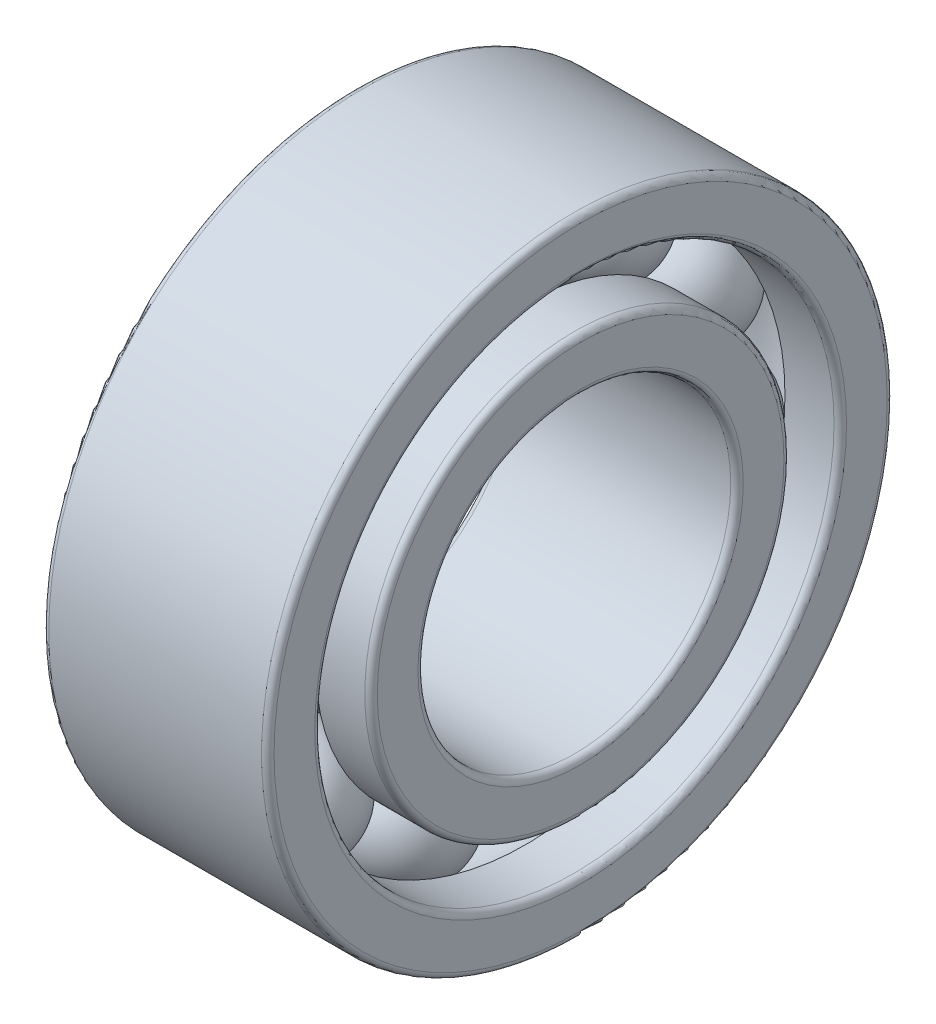
ISO-10303-21;
HEADER;
FILE_DESCRIPTION(('STEP AP214'),'2;1');
FILE_NAME('part.step','',(''),(''),'','','');
FILE_SCHEMA(('AUTOMOTIVE_DESIGN { 1 0 10303 214 1 1 1 1 }'));
ENDSEC;
DATA;
#1=APPLICATION_CONTEXT('core data for automotive mechanical design processes');
#2=APPLICATION_PROTOCOL_DEFINITION('international standard','automotive_design',2000,#1);
#3=PRODUCT_CONTEXT('',#1,'mechanical');
#4=PRODUCT('Part','Part','',(#3));
#5=PRODUCT_RELATED_PRODUCT_CATEGORY('part','',(#4));
#6=PRODUCT_DEFINITION_FORMATION('','',#4);
#7=PRODUCT_DEFINITION_CONTEXT('part definition',#1,'design');
#8=PRODUCT_DEFINITION('design','',#6,#7);
#9=PRODUCT_DEFINITION_SHAPE('','',#8);
#10=(LENGTH_UNIT() NAMED_UNIT(*) SI_UNIT(.MILLI.,.METRE.));
#11=(NAMED_UNIT(*) PLANE_ANGLE_UNIT() SI_UNIT($,.RADIAN.));
#12=(NAMED_UNIT(*) SI_UNIT($,.STERADIAN.) SOLID_ANGLE_UNIT());
#13=UNCERTAINTY_MEASURE_WITH_UNIT(LENGTH_MEASURE(1.E-05),#10,'distance_accuracy_value','');
#14=(GEOMETRIC_REPRESENTATION_CONTEXT(3) GLOBAL_UNCERTAINTY_ASSIGNED_CONTEXT((#13)) GLOBAL_UNIT_ASSIGNED_CONTEXT((#10,
#11,#12)) REPRESENTATION_CONTEXT('',''));
#15=CARTESIAN_POINT('',(0.,0.,0.));
#16=DIRECTION('',(0.,0.,1.));
#17=DIRECTION('',(1.,0.,0.));
#18=AXIS2_PLACEMENT_3D('',#15,#16,#17);
#19=CARTESIAN_POINT('',(-9.,15.7735037405848,-10.1370153272922));
#20=DIRECTION('',(-1.,0.,0.));
#21=DIRECTION('',(0.,0.841253532831188,-0.540640817455586));
#22=AXIS2_PLACEMENT_3D('',#19,#20,#21);
#23=SPHERICAL_SURFACE('',#22,4.75);
#24=CARTESIAN_POINT('',(-13.75,15.7735037405848,-10.1370153272922));
#25=VERTEX_POINT('',#24);
#26=VERTEX_LOOP('',#25);
#27=FACE_BOUND('',#26,.T.);
#28=ADVANCED_FACE('F38',(#27),#23,.T.);
#29=CLOSED_SHELL('',(#28));
#30=MANIFOLD_SOLID_BREP('B2',#29);
#31=CARTESIAN_POINT('',(-9.,7.78903149378557,-17.0555999128971));
#32=DIRECTION('',(-1.,0.,0.));
#33=DIRECTION('',(0.,0.415415013001897,-0.909631995354513));
#34=AXIS2_PLACEMENT_3D('',#31,#32,#33);
#35=SPHERICAL_SURFACE('',#34,4.75);
#36=CARTESIAN_POINT('',(-13.75,7.78903149378557,-17.0555999128971));
#37=VERTEX_POINT('',#36);
#38=VERTEX_LOOP('',#37);
#39=FACE_BOUND('',#38,.T.);
#40=ADVANCED_FACE('F57',(#39),#35,.T.);
#41=CLOSED_SHELL('',(#40));
#42=MANIFOLD_SOLID_BREP('B6',#41);
#43=CARTESIAN_POINT('',(-9.,-2.6684032176239,-18.5591520352675));
#44=DIRECTION('',(-1.,0.,0.));
#45=DIRECTION('',(0.,-0.142314838273275,-0.989821441880934));
#46=AXIS2_PLACEMENT_3D('',#43,#44,#45);
#47=SPHERICAL_SURFACE('',#46,4.75);
#48=CARTESIAN_POINT('',(-13.75,-2.6684032176239,-18.5591520352675));
#49=VERTEX_POINT('',#48);
#50=VERTEX_LOOP('',#49);
#51=FACE_BOUND('',#50,.T.);
#52=ADVANCED_FACE('F76',(#51),#47,.T.);
#53=CLOSED_SHELL('',(#52));
#54=MANIFOLD_SOLID_BREP('B34',#53);
#55=CARTESIAN_POINT('',(-9.,-12.278638761474,-14.1703045191425));
#56=DIRECTION('',(-1.,0.,0.));
#57=DIRECTION('',(0.,-0.654860733945278,-0.755749574354264));
#58=AXIS2_PLACEMENT_3D('',#55,#56,#57);
#59=SPHERICAL_SURFACE('',#58,4.75);
#60=CARTESIAN_POINT('',(-13.75,-12.278638761474,-14.1703045191425));
#61=VERTEX_POINT('',#60);
#62=VERTEX_LOOP('',#61);
#63=FACE_BOUND('',#62,.T.);
#64=ADVANCED_FACE('F95',(#63),#59,.T.);
#65=CLOSED_SHELL('',(#64));
#66=MANIFOLD_SOLID_BREP('B53',#65);
#67=CARTESIAN_POINT('',(-9.,-17.9904932552718,-5.28248544077695));
#68=DIRECTION('',(-1.,0.,0.));
#69=DIRECTION('',(0.,-0.959492973614495,-0.281732556841437));
#70=AXIS2_PLACEMENT_3D('',#67,#68,#69);
#71=SPHERICAL_SURFACE('',#70,4.75);
#72=CARTESIAN_POINT('',(-13.75,-17.9904932552718,-5.28248544077695));
#73=VERTEX_POINT('',#72);
#74=VERTEX_LOOP('',#73);
#75=FACE_BOUND('',#74,.T.);
#76=ADVANCED_FACE('F114',(#75),#71,.T.);
#77=CLOSED_SHELL('',(#76));
#78=MANIFOLD_SOLID_BREP('B72',#77);
#79=CARTESIAN_POINT('',(-9.,-17.9904932552719,5.28248544077669));
#80=DIRECTION('',(-1.,0.,0.));
#81=DIRECTION('',(0.,-0.959492973614499,0.281732556841423));
#82=AXIS2_PLACEMENT_3D('',#79,#80,#81);
#83=SPHERICAL_SURFACE('',#82,4.75);
#84=CARTESIAN_POINT('',(-13.75,-17.9904932552719,5.28248544077669));
#85=VERTEX_POINT('',#84);
#86=VERTEX_LOOP('',#85);
#87=FACE_BOUND('',#86,.T.);
#88=ADVANCED_FACE('F133',(#87),#83,.T.);
#89=CLOSED_SHELL('',(#88));
#90=MANIFOLD_SOLID_BREP('B91',#89);
#91=CARTESIAN_POINT('',(-9.,-12.2786387614742,14.1703045191423));
#92=DIRECTION('',(-1.,0.,0.));
#93=DIRECTION('',(0.,-0.654860733945289,0.755749574354255));
#94=AXIS2_PLACEMENT_3D('',#91,#92,#93);
#95=SPHERICAL_SURFACE('',#94,4.75);
#96=CARTESIAN_POINT('',(-13.75,-12.2786387614742,14.1703045191423));
#97=VERTEX_POINT('',#96);
#98=VERTEX_LOOP('',#97);
#99=FACE_BOUND('',#98,.T.);
#100=ADVANCED_FACE('F152',(#99),#95,.T.);
#101=CLOSED_SHELL('',(#100));
#102=MANIFOLD_SOLID_BREP('B110',#101);
#103=CARTESIAN_POINT('',(-9.,-2.66840321762417,18.5591520352675));
#104=DIRECTION('',(-1.,0.,0.));
#105=DIRECTION('',(0.,-0.142314838273289,0.989821441880932));
#106=AXIS2_PLACEMENT_3D('',#103,#104,#105);
#107=SPHERICAL_SURFACE('',#106,4.75);
#108=CARTESIAN_POINT('',(-13.75,-2.66840321762417,18.5591520352675));
#109=VERTEX_POINT('',#108);
#110=VERTEX_LOOP('',#109);
#111=FACE_BOUND('',#110,.T.);
#112=ADVANCED_FACE('F171',(#111),#107,.T.);
#113=CLOSED_SHELL('',(#112));
#114=MANIFOLD_SOLID_BREP('B129',#113);
#115=CARTESIAN_POINT('',(-9.,7.78903149378533,17.0555999128972));
#116=DIRECTION('',(-1.,0.,0.));
#117=DIRECTION('',(0.,0.415415013001884,0.909631995354519));
#118=AXIS2_PLACEMENT_3D('',#115,#116,#117);
#119=SPHERICAL_SURFACE('',#118,4.75);
#120=CARTESIAN_POINT('',(-13.75,7.78903149378533,17.0555999128972));
#121=VERTEX_POINT('',#120);
#122=VERTEX_LOOP('',#121);
#123=FACE_BOUND('',#122,.T.);
#124=ADVANCED_FACE('F190',(#123),#119,.T.);
#125=CLOSED_SHELL('',(#124));
#126=MANIFOLD_SOLID_BREP('B148',#125);
#127=CARTESIAN_POINT('',(-9.,15.7735037405846,10.1370153272925));
#128=DIRECTION('',(-1.,0.,0.));
#129=DIRECTION('',(0.,0.841253532831181,0.540640817455599));
#130=AXIS2_PLACEMENT_3D('',#127,#128,#129);
#131=SPHERICAL_SURFACE('',#130,4.75);
#132=CARTESIAN_POINT('',(-13.75,15.7735037405846,10.1370153272925));
#133=VERTEX_POINT('',#132);
#134=VERTEX_LOOP('',#133);
#135=FACE_BOUND('',#134,.T.);
#136=ADVANCED_FACE('F209',(#135),#131,.T.);
#137=CLOSED_SHELL('',(#136));
#138=MANIFOLD_SOLID_BREP('B167',#137);
#139=CARTESIAN_POINT('',(-9.,18.75,0.));
#140=DIRECTION('',(-1.,0.,0.));
#141=DIRECTION('',(0.,1.,0.));
#142=AXIS2_PLACEMENT_3D('',#139,#140,#141);
#143=SPHERICAL_SURFACE('',#142,4.75);
#144=CARTESIAN_POINT('',(-13.75,18.75,0.));
#145=VERTEX_POINT('',#144);
#146=VERTEX_LOOP('',#145);
#147=FACE_BOUND('',#146,.T.);
#148=ADVANCED_FACE('F230',(#147),#143,.T.);
#149=CLOSED_SHELL('',(#148));
#150=MANIFOLD_SOLID_BREP('B186',#149);
#151=CARTESIAN_POINT('',(0.,12.5,0.));
#152=DIRECTION('',(1.,0.,0.));
#153=DIRECTION('',(0.,0.,-1.));
#154=AXIS2_PLACEMENT_3D('',#151,#152,#153);
#155=PLANE('',#154);
#156=CARTESIAN_POINT('',(0.,0.,0.));
#157=DIRECTION('',(1.,0.,0.));
#158=DIRECTION('',(0.,0.,-1.));
#159=AXIS2_PLACEMENT_3D('',#156,#157,#158);
#160=CIRCLE('',#159,13.);
#161=CARTESIAN_POINT('',(0.,0.,-13.));
#162=VERTEX_POINT('',#161);
#163=EDGE_CURVE('E261',#162,#162,#160,.F.);
#164=ORIENTED_EDGE('',*,*,#163,.T.);
#165=EDGE_LOOP('',(#164));
#166=FACE_BOUND('',#165,.T.);
#167=CARTESIAN_POINT('',(0.,0.,0.));
#168=DIRECTION('',(1.,0.,0.));
#169=DIRECTION('',(0.,0.,-1.));
#170=AXIS2_PLACEMENT_3D('',#167,#168,#169);
#171=CIRCLE('',#170,16.25);
#172=CARTESIAN_POINT('',(0.,0.,-16.25));
#173=VERTEX_POINT('',#172);
#174=EDGE_CURVE('E265',#173,#173,#171,.T.);
#175=ORIENTED_EDGE('',*,*,#174,.T.);
#176=EDGE_LOOP('',(#175));
#177=FACE_BOUND('',#176,.T.);
#178=ADVANCED_FACE('F250',(#166,#177),#155,.T.);
#179=CARTESIAN_POINT('',(0.,0.,0.));
#180=DIRECTION('',(1.,0.,0.));
#181=DIRECTION('',(0.,0.,-1.));
#182=AXIS2_PLACEMENT_3D('',#179,#180,#181);
#183=CYLINDRICAL_SURFACE('',#182,16.75);
#184=CARTESIAN_POINT('',(-0.5,0.,0.));
#185=DIRECTION('',(1.,0.,0.));
#186=DIRECTION('',(0.,0.,-1.));
#187=AXIS2_PLACEMENT_3D('',#184,#185,#186);
#188=CIRCLE('',#187,16.75);
#189=CARTESIAN_POINT('',(-0.5,0.,-16.75));
#190=VERTEX_POINT('',#189);
#191=EDGE_CURVE('E257',#190,#190,#188,.F.);
#192=ORIENTED_EDGE('',*,*,#191,.T.);
#193=EDGE_LOOP('',(#192));
#194=FACE_BOUND('',#193,.T.);
#195=CARTESIAN_POINT('',(-4.41742430504416,0.,0.));
#196=DIRECTION('',(1.,0.,0.));
#197=DIRECTION('',(0.,0.,-1.));
#198=AXIS2_PLACEMENT_3D('',#195,#196,#197);
#199=CIRCLE('',#198,16.75);
#200=CARTESIAN_POINT('',(-4.41742430504416,0.,-16.75));
#201=VERTEX_POINT('',#200);
#202=EDGE_CURVE('E282',#201,#201,#199,.T.);
#203=ORIENTED_EDGE('',*,*,#202,.T.);
#204=EDGE_LOOP('',(#203));
#205=FACE_BOUND('',#204,.T.);
#206=ADVANCED_FACE('F303',(#194,#205),#183,.T.);
#207=CARTESIAN_POINT('',(-9.,0.,0.));
#208=DIRECTION('',(1.,0.,0.));
#209=DIRECTION('',(0.,0.,-1.));
#210=AXIS2_PLACEMENT_3D('',#207,#208,#209);
#211=TOROIDAL_SURFACE('',#210,18.75,5.);
#212=CARTESIAN_POINT('',(-13.5825756949558,0.,0.));
#213=DIRECTION('',(1.,0.,0.));
#214=DIRECTION('',(0.,0.,-1.));
#215=AXIS2_PLACEMENT_3D('',#212,#213,#214);
#216=CIRCLE('',#215,16.75);
#217=CARTESIAN_POINT('',(-13.5825756949558,0.,-16.75));
#218=VERTEX_POINT('',#217);
#219=EDGE_CURVE('E285',#218,#218,#216,.T.);
#220=ORIENTED_EDGE('',*,*,#219,.T.);
#221=EDGE_LOOP('',(#220));
#222=FACE_BOUND('',#221,.T.);
#223=ORIENTED_EDGE('',*,*,#202,.F.);
#224=EDGE_LOOP('',(#223));
#225=FACE_BOUND('',#224,.T.);
#226=ADVANCED_FACE('F289',(#222,#225),#211,.F.);
#227=CARTESIAN_POINT('',(0.,0.,0.));
#228=DIRECTION('',(1.,0.,0.));
#229=DIRECTION('',(0.,0.,-1.));
#230=AXIS2_PLACEMENT_3D('',#227,#228,#229);
#231=CYLINDRICAL_SURFACE('',#230,16.75);
#232=CARTESIAN_POINT('',(-17.5,0.,0.));
#233=DIRECTION('',(-1.,0.,0.));
#234=DIRECTION('',(0.,0.,1.));
#235=AXIS2_PLACEMENT_3D('',#232,#233,#234);
#236=CIRCLE('',#235,16.75);
#237=CARTESIAN_POINT('',(-17.5,0.,16.75));
#238=VERTEX_POINT('',#237);
#239=EDGE_CURVE('E229',#238,#238,#236,.F.);
#240=ORIENTED_EDGE('',*,*,#239,.T.);
#241=EDGE_LOOP('',(#240));
#242=FACE_BOUND('',#241,.T.);
#243=ORIENTED_EDGE('',*,*,#219,.F.);
#244=EDGE_LOOP('',(#243));
#245=FACE_BOUND('',#244,.T.);
#246=ADVANCED_FACE('F292',(#242,#245),#231,.T.);
#247=CARTESIAN_POINT('',(-18.,16.75,0.));
#248=DIRECTION('',(-1.,0.,0.));
#249=DIRECTION('',(0.,0.,1.));
#250=AXIS2_PLACEMENT_3D('',#247,#248,#249);
#251=PLANE('',#250);
#252=CARTESIAN_POINT('',(-18.,0.,0.));
#253=DIRECTION('',(-1.,0.,0.));
#254=DIRECTION('',(0.,0.,1.));
#255=AXIS2_PLACEMENT_3D('',#252,#253,#254);
#256=CIRCLE('',#255,13.);
#257=CARTESIAN_POINT('',(-18.,0.,13.));
#258=VERTEX_POINT('',#257);
#259=EDGE_CURVE('E276',#258,#258,#256,.F.);
#260=ORIENTED_EDGE('',*,*,#259,.T.);
#261=EDGE_LOOP('',(#260));
#262=FACE_BOUND('',#261,.T.);
#263=CARTESIAN_POINT('',(-18.,0.,0.));
#264=DIRECTION('',(-1.,0.,0.));
#265=DIRECTION('',(0.,0.,1.));
#266=AXIS2_PLACEMENT_3D('',#263,#264,#265);
#267=CIRCLE('',#266,16.25);
#268=CARTESIAN_POINT('',(-18.,0.,16.25));
#269=VERTEX_POINT('',#268);
#270=EDGE_CURVE('E279',#269,#269,#267,.T.);
#271=ORIENTED_EDGE('',*,*,#270,.T.);
#272=EDGE_LOOP('',(#271));
#273=FACE_BOUND('',#272,.T.);
#274=ADVANCED_FACE('F294',(#262,#273),#251,.T.);
#275=CARTESIAN_POINT('',(0.,0.,0.));
#276=DIRECTION('',(1.,0.,0.));
#277=DIRECTION('',(0.,0.,-1.));
#278=AXIS2_PLACEMENT_3D('',#275,#276,#277);
#279=CYLINDRICAL_SURFACE('',#278,12.5);
#280=CARTESIAN_POINT('',(-17.5,0.,0.));
#281=DIRECTION('',(-1.,0.,0.));
#282=DIRECTION('',(0.,0.,1.));
#283=AXIS2_PLACEMENT_3D('',#280,#281,#282);
#284=CIRCLE('',#283,12.5);
#285=CARTESIAN_POINT('',(-17.5,0.,12.5));
#286=VERTEX_POINT('',#285);
#287=EDGE_CURVE('E270',#286,#286,#284,.T.);
#288=ORIENTED_EDGE('',*,*,#287,.T.);
#289=EDGE_LOOP('',(#288));
#290=FACE_BOUND('',#289,.T.);
#291=CARTESIAN_POINT('',(-0.5,0.,0.));
#292=DIRECTION('',(1.,0.,0.));
#293=DIRECTION('',(0.,0.,-1.));
#294=AXIS2_PLACEMENT_3D('',#291,#292,#293);
#295=CIRCLE('',#294,12.5);
#296=CARTESIAN_POINT('',(-0.5,0.,-12.5));
#297=VERTEX_POINT('',#296);
#298=EDGE_CURVE('E273',#297,#297,#295,.T.);
#299=ORIENTED_EDGE('',*,*,#298,.T.);
#300=EDGE_LOOP('',(#299));
#301=FACE_BOUND('',#300,.T.);
#302=ADVANCED_FACE('F300',(#290,#301),#279,.F.);
#303=CARTESIAN_POINT('',(-17.5,0.,0.));
#304=DIRECTION('',(-1.,0.,0.));
#305=DIRECTION('',(0.,0.,1.));
#306=AXIS2_PLACEMENT_3D('',#303,#304,#305);
#307=TOROIDAL_SURFACE('',#306,13.,0.5);
#308=ORIENTED_EDGE('',*,*,#287,.F.);
#309=EDGE_LOOP('',(#308));
#310=FACE_BOUND('',#309,.T.);
#311=ORIENTED_EDGE('',*,*,#259,.F.);
#312=EDGE_LOOP('',(#311));
#313=FACE_BOUND('',#312,.T.);
#314=ADVANCED_FACE('F314',(#310,#313),#307,.T.);
#315=CARTESIAN_POINT('',(-0.5,0.,0.));
#316=DIRECTION('',(1.,0.,0.));
#317=DIRECTION('',(0.,0.,-1.));
#318=AXIS2_PLACEMENT_3D('',#315,#316,#317);
#319=TOROIDAL_SURFACE('',#318,13.,0.5);
#320=ORIENTED_EDGE('',*,*,#163,.F.);
#321=EDGE_LOOP('',(#320));
#322=FACE_BOUND('',#321,.T.);
#323=ORIENTED_EDGE('',*,*,#298,.F.);
#324=EDGE_LOOP('',(#323));
#325=FACE_BOUND('',#324,.T.);
#326=ADVANCED_FACE('F317',(#322,#325),#319,.T.);
#327=CARTESIAN_POINT('',(-0.5,0.,0.));
#328=DIRECTION('',(1.,0.,0.));
#329=DIRECTION('',(0.,0.,-1.));
#330=AXIS2_PLACEMENT_3D('',#327,#328,#329);
#331=TOROIDAL_SURFACE('',#330,16.25,0.5);
#332=ORIENTED_EDGE('',*,*,#191,.F.);
#333=EDGE_LOOP('',(#332));
#334=FACE_BOUND('',#333,.T.);
#335=ORIENTED_EDGE('',*,*,#174,.F.);
#336=EDGE_LOOP('',(#335));
#337=FACE_BOUND('',#336,.T.);
#338=ADVANCED_FACE('F320',(#334,#337),#331,.T.);
#339=CARTESIAN_POINT('',(-17.5,0.,0.));
#340=DIRECTION('',(-1.,0.,0.));
#341=DIRECTION('',(0.,0.,1.));
#342=AXIS2_PLACEMENT_3D('',#339,#340,#341);
#343=TOROIDAL_SURFACE('',#342,16.25,0.5);
#344=ORIENTED_EDGE('',*,*,#270,.F.);
#345=EDGE_LOOP('',(#344));
#346=FACE_BOUND('',#345,.T.);
#347=ORIENTED_EDGE('',*,*,#239,.F.);
#348=EDGE_LOOP('',(#347));
#349=FACE_BOUND('',#348,.T.);
#350=ADVANCED_FACE('F252',(#346,#349),#343,.T.);
#351=CLOSED_SHELL('',(#178,#206,#226,#246,#274,#302,#314,#326,#338,#350));
#352=MANIFOLD_SOLID_BREP('B205',#351);
#353=CARTESIAN_POINT('',(0.,20.75,0.));
#354=DIRECTION('',(1.,0.,0.));
#355=DIRECTION('',(0.,0.,-1.));
#356=AXIS2_PLACEMENT_3D('',#353,#354,#355);
#357=PLANE('',#356);
#358=CARTESIAN_POINT('',(0.,0.,0.));
#359=DIRECTION('',(1.,0.,0.));
#360=DIRECTION('',(0.,0.,-1.));
#361=AXIS2_PLACEMENT_3D('',#358,#359,#360);
#362=CIRCLE('',#361,21.25);
#363=CARTESIAN_POINT('',(0.,0.,-21.25));
#364=VERTEX_POINT('',#363);
#365=EDGE_CURVE('E413',#364,#364,#362,.F.);
#366=ORIENTED_EDGE('',*,*,#365,.T.);
#367=EDGE_LOOP('',(#366));
#368=FACE_BOUND('',#367,.T.);
#369=CARTESIAN_POINT('',(0.,0.,0.));
#370=DIRECTION('',(1.,0.,0.));
#371=DIRECTION('',(0.,0.,-1.));
#372=AXIS2_PLACEMENT_3D('',#369,#370,#371);
#373=CIRCLE('',#372,24.5);
#374=CARTESIAN_POINT('',(0.,0.,-24.5));
#375=VERTEX_POINT('',#374);
#376=EDGE_CURVE('E417',#375,#375,#373,.T.);
#377=ORIENTED_EDGE('',*,*,#376,.T.);
#378=EDGE_LOOP('',(#377));
#379=FACE_BOUND('',#378,.T.);
#380=ADVANCED_FACE('F402',(#368,#379),#357,.T.);
#381=CARTESIAN_POINT('',(0.,0.,0.));
#382=DIRECTION('',(1.,0.,0.));
#383=DIRECTION('',(0.,0.,-1.));
#384=AXIS2_PLACEMENT_3D('',#381,#382,#383);
#385=CYLINDRICAL_SURFACE('',#384,25.);
#386=CARTESIAN_POINT('',(-0.5,0.,0.));
#387=DIRECTION('',(1.,0.,0.));
#388=DIRECTION('',(0.,0.,-1.));
#389=AXIS2_PLACEMENT_3D('',#386,#387,#388);
#390=CIRCLE('',#389,25.);
#391=CARTESIAN_POINT('',(-0.5,0.,-25.));
#392=VERTEX_POINT('',#391);
#393=EDGE_CURVE('E249',#392,#392,#390,.F.);
#394=ORIENTED_EDGE('',*,*,#393,.T.);
#395=EDGE_LOOP('',(#394));
#396=FACE_BOUND('',#395,.T.);
#397=CARTESIAN_POINT('',(-17.5,0.,0.));
#398=DIRECTION('',(-1.,0.,0.));
#399=DIRECTION('',(0.,0.,1.));
#400=AXIS2_PLACEMENT_3D('',#397,#398,#399);
#401=CIRCLE('',#400,25.);
#402=CARTESIAN_POINT('',(-17.5,0.,25.));
#403=VERTEX_POINT('',#402);
#404=EDGE_CURVE('E409',#403,#403,#401,.F.);
#405=ORIENTED_EDGE('',*,*,#404,.T.);
#406=EDGE_LOOP('',(#405));
#407=FACE_BOUND('',#406,.T.);
#408=ADVANCED_FACE('F459',(#396,#407),#385,.T.);
#409=CARTESIAN_POINT('',(-18.,25.,0.));
#410=DIRECTION('',(-1.,0.,0.));
#411=DIRECTION('',(0.,0.,1.));
#412=AXIS2_PLACEMENT_3D('',#409,#410,#411);
#413=PLANE('',#412);
#414=CARTESIAN_POINT('',(-18.,0.,0.));
#415=DIRECTION('',(-1.,0.,0.));
#416=DIRECTION('',(0.,0.,1.));
#417=AXIS2_PLACEMENT_3D('',#414,#415,#416);
#418=CIRCLE('',#417,21.25);
#419=CARTESIAN_POINT('',(-18.,0.,21.25));
#420=VERTEX_POINT('',#419);
#421=EDGE_CURVE('E428',#420,#420,#418,.F.);
#422=ORIENTED_EDGE('',*,*,#421,.T.);
#423=EDGE_LOOP('',(#422));
#424=FACE_BOUND('',#423,.T.);
#425=CARTESIAN_POINT('',(-18.,0.,0.));
#426=DIRECTION('',(-1.,0.,0.));
#427=DIRECTION('',(0.,0.,1.));
#428=AXIS2_PLACEMENT_3D('',#425,#426,#427);
#429=CIRCLE('',#428,24.5);
#430=CARTESIAN_POINT('',(-18.,0.,24.5));
#431=VERTEX_POINT('',#430);
#432=EDGE_CURVE('E431',#431,#431,#429,.T.);
#433=ORIENTED_EDGE('',*,*,#432,.T.);
#434=EDGE_LOOP('',(#433));
#435=FACE_BOUND('',#434,.T.);
#436=ADVANCED_FACE('F465',(#424,#435),#413,.T.);
#437=CARTESIAN_POINT('',(0.,0.,0.));
#438=DIRECTION('',(1.,0.,0.));
#439=DIRECTION('',(0.,0.,-1.));
#440=AXIS2_PLACEMENT_3D('',#437,#438,#439);
#441=CYLINDRICAL_SURFACE('',#440,20.75);
#442=CARTESIAN_POINT('',(-17.5,0.,0.));
#443=DIRECTION('',(-1.,0.,0.));
#444=DIRECTION('',(0.,0.,1.));
#445=AXIS2_PLACEMENT_3D('',#442,#443,#444);
#446=CIRCLE('',#445,20.75);
#447=CARTESIAN_POINT('',(-17.5,0.,20.75));
#448=VERTEX_POINT('',#447);
#449=EDGE_CURVE('E425',#448,#448,#446,.T.);
#450=ORIENTED_EDGE('',*,*,#449,.T.);
#451=EDGE_LOOP('',(#450));
#452=FACE_BOUND('',#451,.T.);
#453=CARTESIAN_POINT('',(-13.5825756949558,0.,0.));
#454=DIRECTION('',(1.,0.,0.));
#455=DIRECTION('',(0.,0.,-1.));
#456=AXIS2_PLACEMENT_3D('',#453,#454,#455);
#457=CIRCLE('',#456,20.75);
#458=CARTESIAN_POINT('',(-13.5825756949558,0.,-20.75));
#459=VERTEX_POINT('',#458);
#460=EDGE_CURVE('E434',#459,#459,#457,.T.);
#461=ORIENTED_EDGE('',*,*,#460,.T.);
#462=EDGE_LOOP('',(#461));
#463=FACE_BOUND('',#462,.T.);
#464=ADVANCED_FACE('F456',(#452,#463),#441,.F.);
#465=CARTESIAN_POINT('',(-9.,0.,0.));
#466=DIRECTION('',(1.,0.,0.));
#467=DIRECTION('',(0.,0.,-1.));
#468=AXIS2_PLACEMENT_3D('',#465,#466,#467);
#469=TOROIDAL_SURFACE('',#468,18.75,5.);
#470=CARTESIAN_POINT('',(-4.41742430504416,0.,0.));
#471=DIRECTION('',(1.,0.,0.));
#472=DIRECTION('',(0.,0.,-1.));
#473=AXIS2_PLACEMENT_3D('',#470,#471,#472);
#474=CIRCLE('',#473,20.75);
#475=CARTESIAN_POINT('',(-4.41742430504416,0.,-20.75));
#476=VERTEX_POINT('',#475);
#477=EDGE_CURVE('E437',#476,#476,#474,.T.);
#478=ORIENTED_EDGE('',*,*,#477,.T.);
#479=EDGE_LOOP('',(#478));
#480=FACE_BOUND('',#479,.T.);
#481=ORIENTED_EDGE('',*,*,#460,.F.);
#482=EDGE_LOOP('',(#481));
#483=FACE_BOUND('',#482,.T.);
#484=ADVANCED_FACE('F441',(#480,#483),#469,.F.);
#485=CARTESIAN_POINT('',(0.,0.,0.));
#486=DIRECTION('',(1.,0.,0.));
#487=DIRECTION('',(0.,0.,-1.));
#488=AXIS2_PLACEMENT_3D('',#485,#486,#487);
#489=CYLINDRICAL_SURFACE('',#488,20.75);
#490=CARTESIAN_POINT('',(-0.5,0.,0.));
#491=DIRECTION('',(1.,0.,0.));
#492=DIRECTION('',(0.,0.,-1.));
#493=AXIS2_PLACEMENT_3D('',#490,#491,#492);
#494=CIRCLE('',#493,20.75);
#495=CARTESIAN_POINT('',(-0.5,0.,-20.75));
#496=VERTEX_POINT('',#495);
#497=EDGE_CURVE('E422',#496,#496,#494,.T.);
#498=ORIENTED_EDGE('',*,*,#497,.T.);
#499=EDGE_LOOP('',(#498));
#500=FACE_BOUND('',#499,.T.);
#501=ORIENTED_EDGE('',*,*,#477,.F.);
#502=EDGE_LOOP('',(#501));
#503=FACE_BOUND('',#502,.T.);
#504=ADVANCED_FACE('F444',(#500,#503),#489,.F.);
#505=CARTESIAN_POINT('',(-17.5,0.,0.));
#506=DIRECTION('',(-1.,0.,0.));
#507=DIRECTION('',(0.,0.,1.));
#508=AXIS2_PLACEMENT_3D('',#505,#506,#507);
#509=TOROIDAL_SURFACE('',#508,21.25,0.5);
#510=ORIENTED_EDGE('',*,*,#449,.F.);
#511=EDGE_LOOP('',(#510));
#512=FACE_BOUND('',#511,.T.);
#513=ORIENTED_EDGE('',*,*,#421,.F.);
#514=EDGE_LOOP('',(#513));
#515=FACE_BOUND('',#514,.T.);
#516=ADVANCED_FACE('F446',(#512,#515),#509,.T.);
#517=CARTESIAN_POINT('',(-0.5,0.,0.));
#518=DIRECTION('',(1.,0.,0.));
#519=DIRECTION('',(0.,0.,-1.));
#520=AXIS2_PLACEMENT_3D('',#517,#518,#519);
#521=TOROIDAL_SURFACE('',#520,21.25,0.5);
#522=ORIENTED_EDGE('',*,*,#365,.F.);
#523=EDGE_LOOP('',(#522));
#524=FACE_BOUND('',#523,.T.);
#525=ORIENTED_EDGE('',*,*,#497,.F.);
#526=EDGE_LOOP('',(#525));
#527=FACE_BOUND('',#526,.T.);
#528=ADVANCED_FACE('F453',(#524,#527),#521,.T.);
#529=CARTESIAN_POINT('',(-0.5,0.,0.));
#530=DIRECTION('',(1.,0.,0.));
#531=DIRECTION('',(0.,0.,-1.));
#532=AXIS2_PLACEMENT_3D('',#529,#530,#531);
#533=TOROIDAL_SURFACE('',#532,24.5,0.5);
#534=ORIENTED_EDGE('',*,*,#393,.F.);
#535=EDGE_LOOP('',(#534));
#536=FACE_BOUND('',#535,.T.);
#537=ORIENTED_EDGE('',*,*,#376,.F.);
#538=EDGE_LOOP('',(#537));
#539=FACE_BOUND('',#538,.T.);
#540=ADVANCED_FACE('F471',(#536,#539),#533,.T.);
#541=CARTESIAN_POINT('',(-17.5,0.,0.));
#542=DIRECTION('',(-1.,0.,0.));
#543=DIRECTION('',(0.,0.,1.));
#544=AXIS2_PLACEMENT_3D('',#541,#542,#543);
#545=TOROIDAL_SURFACE('',#544,24.5,0.5);
#546=ORIENTED_EDGE('',*,*,#432,.F.);
#547=EDGE_LOOP('',(#546));
#548=FACE_BOUND('',#547,.T.);
#549=ORIENTED_EDGE('',*,*,#404,.F.);
#550=EDGE_LOOP('',(#549));
#551=FACE_BOUND('',#550,.T.);
#552=ADVANCED_FACE('F404',(#548,#551),#545,.T.);
#553=CLOSED_SHELL('',(#380,#408,#436,#464,#484,#504,#516,#528,#540,#552));
#554=MANIFOLD_SOLID_BREP('B224',#553);
#555=ADVANCED_BREP_SHAPE_REPRESENTATION('',(#18,#30,#42,#54,#66,#78,#90,#102,#114,#126,#138,
#150,#352,#554),#14);
#556=SHAPE_DEFINITION_REPRESENTATION(#9,#555);
ENDSEC;
END-ISO-10303-21;
